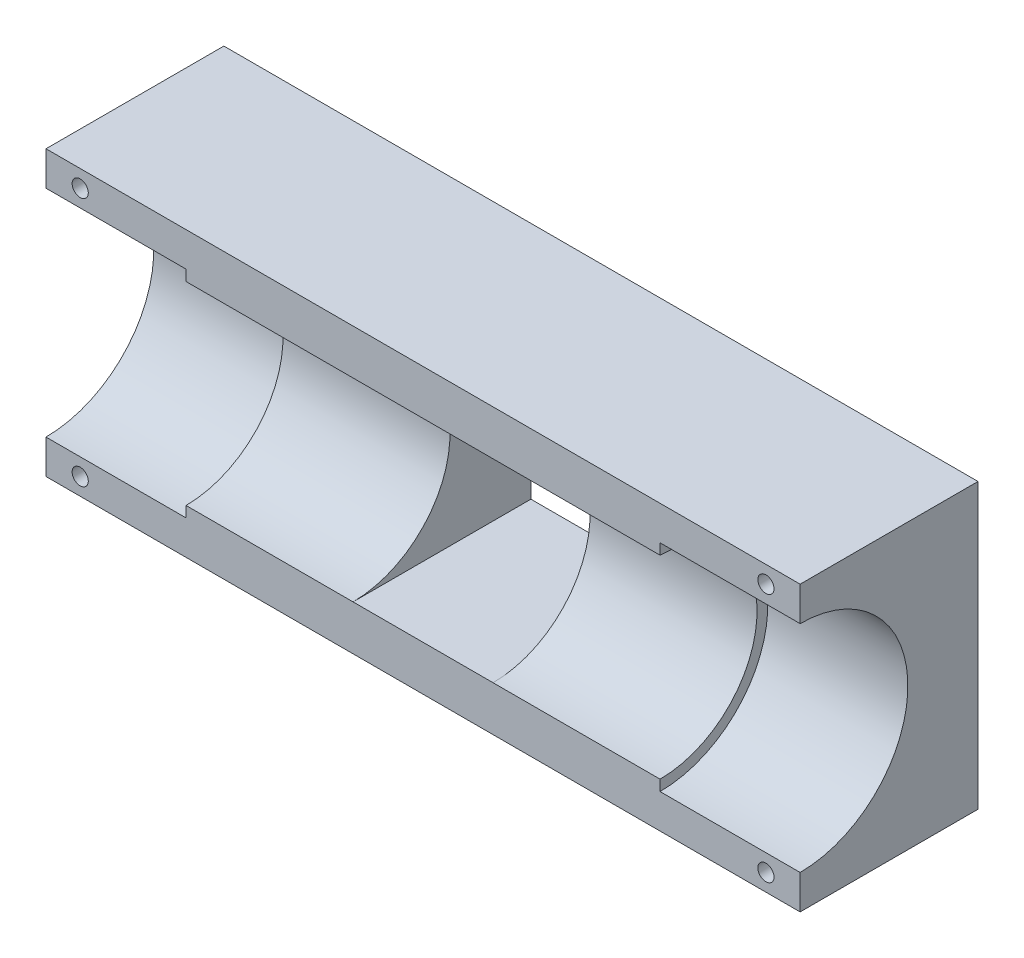
ISO-10303-21;
HEADER;
FILE_DESCRIPTION(('STEP AP214'),'2;1');
FILE_NAME('part.step','',(''),(''),'','','');
FILE_SCHEMA(('AUTOMOTIVE_DESIGN { 1 0 10303 214 1 1 1 1 }'));
ENDSEC;
DATA;
#1=APPLICATION_CONTEXT('core data for automotive mechanical design processes');
#2=APPLICATION_PROTOCOL_DEFINITION('international standard','automotive_design',2000,#1);
#3=PRODUCT_CONTEXT('',#1,'mechanical');
#4=PRODUCT('Part','Part','',(#3));
#5=PRODUCT_RELATED_PRODUCT_CATEGORY('part','',(#4));
#6=PRODUCT_DEFINITION_FORMATION('','',#4);
#7=PRODUCT_DEFINITION_CONTEXT('part definition',#1,'design');
#8=PRODUCT_DEFINITION('design','',#6,#7);
#9=PRODUCT_DEFINITION_SHAPE('','',#8);
#10=(LENGTH_UNIT() NAMED_UNIT(*) SI_UNIT(.MILLI.,.METRE.));
#11=(NAMED_UNIT(*) PLANE_ANGLE_UNIT() SI_UNIT($,.RADIAN.));
#12=(NAMED_UNIT(*) SI_UNIT($,.STERADIAN.) SOLID_ANGLE_UNIT());
#13=UNCERTAINTY_MEASURE_WITH_UNIT(LENGTH_MEASURE(1.E-05),#10,'distance_accuracy_value','');
#14=(GEOMETRIC_REPRESENTATION_CONTEXT(3) GLOBAL_UNCERTAINTY_ASSIGNED_CONTEXT((#13)) GLOBAL_UNIT_ASSIGNED_CONTEXT((#10,
#11,#12)) REPRESENTATION_CONTEXT('',''));
#15=CARTESIAN_POINT('',(0.,0.,0.));
#16=DIRECTION('',(0.,0.,1.));
#17=DIRECTION('',(1.,0.,0.));
#18=AXIS2_PLACEMENT_3D('',#15,#16,#17);
#19=CARTESIAN_POINT('',(139.999999908,26.3499981,33.02));
#20=DIRECTION('',(-1.,0.,0.));
#21=DIRECTION('',(0.,0.,1.));
#22=AXIS2_PLACEMENT_3D('',#19,#20,#21);
#23=CYLINDRICAL_SURFACE('',#22,18.);
#24=DIRECTION('',(-1.,0.,0.));
#25=VECTOR('',#24,1.);
#26=CARTESIAN_POINT('',(139.999999908,8.3499981,33.02));
#27=LINE('',#26,#25);
#28=CARTESIAN_POINT('',(56.999999954,8.34999809999999,33.02));
#29=VERTEX_POINT('',#28);
#30=CARTESIAN_POINT('',(26.,8.3499981,33.02));
#31=VERTEX_POINT('',#30);
#32=EDGE_CURVE('E161',#29,#31,#27,.T.);
#33=ORIENTED_EDGE('',*,*,#32,.F.);
#34=CARTESIAN_POINT('',(56.999999954,26.3499981,33.02));
#35=DIRECTION('',(-1.,0.,0.));
#36=DIRECTION('',(0.,0.,1.));
#37=AXIS2_PLACEMENT_3D('',#34,#35,#36);
#38=CIRCLE('',#37,18.);
#39=CARTESIAN_POINT('',(56.999999954,44.3499981,33.02));
#40=VERTEX_POINT('',#39);
#41=EDGE_CURVE('E139',#29,#40,#38,.F.);
#42=ORIENTED_EDGE('',*,*,#41,.T.);
#43=DIRECTION('',(-1.,0.,0.));
#44=VECTOR('',#43,1.);
#45=CARTESIAN_POINT('',(139.999999908,44.3499981,33.02));
#46=LINE('',#45,#44);
#47=CARTESIAN_POINT('',(26.,44.3499981,33.02));
#48=VERTEX_POINT('',#47);
#49=EDGE_CURVE('E159',#40,#48,#46,.T.);
#50=ORIENTED_EDGE('',*,*,#49,.T.);
#51=CARTESIAN_POINT('',(26.,26.3499981,33.02));
#52=DIRECTION('',(-1.,0.,0.));
#53=DIRECTION('',(0.,0.,1.));
#54=AXIS2_PLACEMENT_3D('',#51,#52,#53);
#55=CIRCLE('',#54,18.);
#56=EDGE_CURVE('E227',#31,#48,#55,.F.);
#57=ORIENTED_EDGE('',*,*,#56,.F.);
#58=EDGE_LOOP('',(#33,#42,#50,#57));
#59=FACE_BOUND('',#58,.T.);
#60=ADVANCED_FACE('F38',(#59),#23,.F.);
#61=CARTESIAN_POINT('',(113.999999908,44.3499981,33.02));
#62=VERTEX_POINT('',#61);
#63=CARTESIAN_POINT('',(82.999999954,44.3499981,33.02));
#64=VERTEX_POINT('',#63);
#65=EDGE_CURVE('E173',#62,#64,#46,.T.);
#66=ORIENTED_EDGE('',*,*,#65,.T.);
#67=CARTESIAN_POINT('',(82.999999954,26.3499981,33.02));
#68=DIRECTION('',(1.,0.,0.));
#69=DIRECTION('',(0.,0.,-1.));
#70=AXIS2_PLACEMENT_3D('',#67,#68,#69);
#71=CIRCLE('',#70,18.);
#72=CARTESIAN_POINT('',(82.999999954,8.34999809999999,33.02));
#73=VERTEX_POINT('',#72);
#74=EDGE_CURVE('E165',#64,#73,#71,.F.);
#75=ORIENTED_EDGE('',*,*,#74,.T.);
#76=CARTESIAN_POINT('',(113.999999908,8.34999810000001,33.02));
#77=VERTEX_POINT('',#76);
#78=EDGE_CURVE('E174',#77,#73,#27,.T.);
#79=ORIENTED_EDGE('',*,*,#78,.F.);
#80=CARTESIAN_POINT('',(113.999999908,26.3499981,33.02));
#81=DIRECTION('',(-1.,0.,0.));
#82=DIRECTION('',(0.,0.,1.));
#83=AXIS2_PLACEMENT_3D('',#80,#81,#82);
#84=CIRCLE('',#83,18.);
#85=EDGE_CURVE('E272',#77,#62,#84,.F.);
#86=ORIENTED_EDGE('',*,*,#85,.T.);
#87=EDGE_LOOP('',(#66,#75,#79,#86));
#88=FACE_BOUND('',#87,.T.);
#89=ADVANCED_FACE('F345',(#88),#23,.F.);
#90=CARTESIAN_POINT('',(0.,0.,33.02));
#91=DIRECTION('',(0.,0.,-1.));
#92=DIRECTION('',(-1.,0.,0.));
#93=AXIS2_PLACEMENT_3D('',#90,#91,#92);
#94=PLANE('',#93);
#95=CARTESIAN_POINT('',(6.35,3.17499905,33.02));
#96=DIRECTION('',(0.,0.,-1.));
#97=DIRECTION('',(-1.,0.,0.));
#98=AXIS2_PLACEMENT_3D('',#95,#96,#97);
#99=CIRCLE('',#98,1.5);
#100=CARTESIAN_POINT('',(4.85,3.17499905,33.02));
#101=VERTEX_POINT('',#100);
#102=EDGE_CURVE('E154',#101,#101,#99,.T.);
#103=ORIENTED_EDGE('',*,*,#102,.T.);
#104=EDGE_LOOP('',(#103));
#105=FACE_BOUND('',#104,.T.);
#106=CARTESIAN_POINT('',(133.649999908,3.17499905,33.02));
#107=DIRECTION('',(0.,0.,-1.));
#108=DIRECTION('',(-1.,0.,0.));
#109=AXIS2_PLACEMENT_3D('',#106,#107,#108);
#110=CIRCLE('',#109,1.5);
#111=CARTESIAN_POINT('',(132.149999908,3.17499905,33.02));
#112=VERTEX_POINT('',#111);
#113=EDGE_CURVE('E520',#112,#112,#110,.T.);
#114=ORIENTED_EDGE('',*,*,#113,.T.);
#115=EDGE_LOOP('',(#114));
#116=FACE_BOUND('',#115,.T.);
#117=DIRECTION('',(0.,1.,0.));
#118=VECTOR('',#117,1.);
#119=CARTESIAN_POINT('',(139.999999908,0.,33.02));
#120=LINE('',#119,#118);
#121=CARTESIAN_POINT('',(139.999999908,0.,33.02));
#122=VERTEX_POINT('',#121);
#123=CARTESIAN_POINT('',(139.999999908,6.3499981,33.02));
#124=VERTEX_POINT('',#123);
#125=EDGE_CURVE('E192',#122,#124,#120,.T.);
#126=ORIENTED_EDGE('',*,*,#125,.T.);
#127=DIRECTION('',(1.,0.,0.));
#128=VECTOR('',#127,1.);
#129=CARTESIAN_POINT('',(113.999999908,6.3499981,33.02));
#130=LINE('',#129,#128);
#131=CARTESIAN_POINT('',(113.999999908,6.3499981,33.02));
#132=VERTEX_POINT('',#131);
#133=EDGE_CURVE('E269',#132,#124,#130,.T.);
#134=ORIENTED_EDGE('',*,*,#133,.F.);
#135=DIRECTION('',(0.,-1.,0.));
#136=VECTOR('',#135,1.);
#137=CARTESIAN_POINT('',(113.999999908,46.3499981,33.02));
#138=LINE('',#137,#136);
#139=EDGE_CURVE('E262',#77,#132,#138,.T.);
#140=ORIENTED_EDGE('',*,*,#139,.F.);
#141=ORIENTED_EDGE('',*,*,#78,.T.);
#142=DIRECTION('',(-1.,0.,0.));
#143=VECTOR('',#142,1.);
#144=CARTESIAN_POINT('',(82.999999954,8.34999809999999,33.02));
#145=LINE('',#144,#143);
#146=EDGE_CURVE('E144',#73,#29,#145,.T.);
#147=ORIENTED_EDGE('',*,*,#146,.T.);
#148=ORIENTED_EDGE('',*,*,#32,.T.);
#149=DIRECTION('',(0.,1.,0.));
#150=VECTOR('',#149,1.);
#151=CARTESIAN_POINT('',(26.,46.3499981,33.02));
#152=LINE('',#151,#150);
#153=CARTESIAN_POINT('',(26.,6.3499981,33.02));
#154=VERTEX_POINT('',#153);
#155=EDGE_CURVE('E284',#154,#31,#152,.T.);
#156=ORIENTED_EDGE('',*,*,#155,.F.);
#157=DIRECTION('',(-1.,0.,0.));
#158=VECTOR('',#157,1.);
#159=CARTESIAN_POINT('',(26.,6.3499981,33.02));
#160=LINE('',#159,#158);
#161=CARTESIAN_POINT('',(0.,6.3499981,33.02));
#162=VERTEX_POINT('',#161);
#163=EDGE_CURVE('E288',#154,#162,#160,.T.);
#164=ORIENTED_EDGE('',*,*,#163,.T.);
#165=DIRECTION('',(0.,-1.,0.));
#166=VECTOR('',#165,1.);
#167=CARTESIAN_POINT('',(0.,0.,33.02));
#168=LINE('',#167,#166);
#169=CARTESIAN_POINT('',(0.,0.,33.02));
#170=VERTEX_POINT('',#169);
#171=EDGE_CURVE('E188',#162,#170,#168,.T.);
#172=ORIENTED_EDGE('',*,*,#171,.T.);
#173=DIRECTION('',(1.,0.,0.));
#174=VECTOR('',#173,1.);
#175=CARTESIAN_POINT('',(0.,0.,33.02));
#176=LINE('',#175,#174);
#177=EDGE_CURVE('E187',#170,#122,#176,.T.);
#178=ORIENTED_EDGE('',*,*,#177,.T.);
#179=EDGE_LOOP('',(#126,#134,#140,#141,#147,#148,#156,#164,#172,#178));
#180=FACE_BOUND('',#179,.T.);
#181=ADVANCED_FACE('F298',(#105,#116,#180),#94,.F.);
#182=CARTESIAN_POINT('',(0.,0.,33.02));
#183=DIRECTION('',(1.,0.,0.));
#184=DIRECTION('',(0.,0.,-1.));
#185=AXIS2_PLACEMENT_3D('',#182,#183,#184);
#186=PLANE('',#185);
#187=ORIENTED_EDGE('',*,*,#171,.F.);
#188=CARTESIAN_POINT('',(0.,26.3499981,33.02));
#189=DIRECTION('',(-1.,0.,0.));
#190=DIRECTION('',(0.,0.,1.));
#191=AXIS2_PLACEMENT_3D('',#188,#189,#190);
#192=CIRCLE('',#191,20.);
#193=CARTESIAN_POINT('',(0.,46.3499981,33.02));
#194=VERTEX_POINT('',#193);
#195=EDGE_CURVE('E279',#194,#162,#192,.T.);
#196=ORIENTED_EDGE('',*,*,#195,.F.);
#197=CARTESIAN_POINT('',(0.,52.6999962,33.02));
#198=VERTEX_POINT('',#197);
#199=EDGE_CURVE('E183',#198,#194,#168,.T.);
#200=ORIENTED_EDGE('',*,*,#199,.F.);
#201=DIRECTION('',(0.,0.,-1.));
#202=VECTOR('',#201,1.);
#203=CARTESIAN_POINT('',(0.,52.6999962,33.02));
#204=LINE('',#203,#202);
#205=CARTESIAN_POINT('',(0.,52.6999962,0.));
#206=VERTEX_POINT('',#205);
#207=EDGE_CURVE('E199',#198,#206,#204,.T.);
#208=ORIENTED_EDGE('',*,*,#207,.T.);
#209=DIRECTION('',(0.,-1.,0.));
#210=VECTOR('',#209,1.);
#211=CARTESIAN_POINT('',(0.,0.,0.));
#212=LINE('',#211,#210);
#213=CARTESIAN_POINT('',(0.,0.,0.));
#214=VERTEX_POINT('',#213);
#215=EDGE_CURVE('E178',#206,#214,#212,.T.);
#216=ORIENTED_EDGE('',*,*,#215,.T.);
#217=DIRECTION('',(0.,0.,-1.));
#218=VECTOR('',#217,1.);
#219=CARTESIAN_POINT('',(0.,0.,33.02));
#220=LINE('',#219,#218);
#221=EDGE_CURVE('E223',#170,#214,#220,.T.);
#222=ORIENTED_EDGE('',*,*,#221,.F.);
#223=EDGE_LOOP('',(#187,#196,#200,#208,#216,#222));
#224=FACE_BOUND('',#223,.T.);
#225=ADVANCED_FACE('F40',(#224),#186,.F.);
#226=CARTESIAN_POINT('',(0.,0.,33.02));
#227=DIRECTION('',(0.,1.,0.));
#228=DIRECTION('',(0.,0.,1.));
#229=AXIS2_PLACEMENT_3D('',#226,#227,#228);
#230=PLANE('',#229);
#231=DIRECTION('',(1.,0.,0.));
#232=VECTOR('',#231,1.);
#233=CARTESIAN_POINT('',(0.,0.,0.));
#234=LINE('',#233,#232);
#235=CARTESIAN_POINT('',(139.999999908,0.,0.));
#236=VERTEX_POINT('',#235);
#237=EDGE_CURVE('E203',#214,#236,#234,.T.);
#238=ORIENTED_EDGE('',*,*,#237,.T.);
#239=DIRECTION('',(0.,0.,-1.));
#240=VECTOR('',#239,1.);
#241=CARTESIAN_POINT('',(139.999999908,0.,33.02));
#242=LINE('',#241,#240);
#243=EDGE_CURVE('E219',#122,#236,#242,.T.);
#244=ORIENTED_EDGE('',*,*,#243,.F.);
#245=ORIENTED_EDGE('',*,*,#177,.F.);
#246=ORIENTED_EDGE('',*,*,#221,.T.);
#247=EDGE_LOOP('',(#238,#244,#245,#246));
#248=FACE_BOUND('',#247,.T.);
#249=ADVANCED_FACE('F337',(#248),#230,.F.);
#250=CARTESIAN_POINT('',(139.999999908,0.,33.02));
#251=DIRECTION('',(-1.,0.,0.));
#252=DIRECTION('',(0.,0.,1.));
#253=AXIS2_PLACEMENT_3D('',#250,#251,#252);
#254=PLANE('',#253);
#255=CARTESIAN_POINT('',(139.999999908,46.3499981,33.02));
#256=VERTEX_POINT('',#255);
#257=CARTESIAN_POINT('',(139.999999908,52.6999962,33.02));
#258=VERTEX_POINT('',#257);
#259=EDGE_CURVE('E191',#256,#258,#120,.T.);
#260=ORIENTED_EDGE('',*,*,#259,.F.);
#261=CARTESIAN_POINT('',(139.999999908,26.3499981,33.02));
#262=DIRECTION('',(1.,0.,0.));
#263=DIRECTION('',(0.,0.,1.));
#264=AXIS2_PLACEMENT_3D('',#261,#262,#263);
#265=CIRCLE('',#264,20.);
#266=EDGE_CURVE('E164',#124,#256,#265,.T.);
#267=ORIENTED_EDGE('',*,*,#266,.F.);
#268=ORIENTED_EDGE('',*,*,#125,.F.);
#269=ORIENTED_EDGE('',*,*,#243,.T.);
#270=DIRECTION('',(0.,1.,0.));
#271=VECTOR('',#270,1.);
#272=CARTESIAN_POINT('',(139.999999908,0.,0.));
#273=LINE('',#272,#271);
#274=CARTESIAN_POINT('',(139.999999908,52.6999962,0.));
#275=VERTEX_POINT('',#274);
#276=EDGE_CURVE('E206',#236,#275,#273,.T.);
#277=ORIENTED_EDGE('',*,*,#276,.T.);
#278=DIRECTION('',(0.,0.,-1.));
#279=VECTOR('',#278,1.);
#280=CARTESIAN_POINT('',(139.999999908,52.6999962,33.02));
#281=LINE('',#280,#279);
#282=EDGE_CURVE('E215',#258,#275,#281,.T.);
#283=ORIENTED_EDGE('',*,*,#282,.F.);
#284=EDGE_LOOP('',(#260,#267,#268,#269,#277,#283));
#285=FACE_BOUND('',#284,.T.);
#286=ADVANCED_FACE('F315',(#285),#254,.F.);
#287=CARTESIAN_POINT('',(0.,52.6999962,33.02));
#288=DIRECTION('',(0.,-1.,0.));
#289=DIRECTION('',(0.,0.,-1.));
#290=AXIS2_PLACEMENT_3D('',#287,#288,#289);
#291=PLANE('',#290);
#292=DIRECTION('',(-1.,0.,0.));
#293=VECTOR('',#292,1.);
#294=CARTESIAN_POINT('',(0.,52.6999962,0.));
#295=LINE('',#294,#293);
#296=EDGE_CURVE('E209',#275,#206,#295,.T.);
#297=ORIENTED_EDGE('',*,*,#296,.T.);
#298=ORIENTED_EDGE('',*,*,#207,.F.);
#299=DIRECTION('',(-1.,0.,0.));
#300=VECTOR('',#299,1.);
#301=CARTESIAN_POINT('',(0.,52.6999962,33.02));
#302=LINE('',#301,#300);
#303=EDGE_CURVE('E196',#258,#198,#302,.T.);
#304=ORIENTED_EDGE('',*,*,#303,.F.);
#305=ORIENTED_EDGE('',*,*,#282,.T.);
#306=EDGE_LOOP('',(#297,#298,#304,#305));
#307=FACE_BOUND('',#306,.T.);
#308=ADVANCED_FACE('F319',(#307),#291,.F.);
#309=CARTESIAN_POINT('',(133.649999908,49.52499715,33.02));
#310=DIRECTION('',(0.,0.,-1.));
#311=DIRECTION('',(-1.,0.,0.));
#312=AXIS2_PLACEMENT_3D('',#309,#310,#311);
#313=CIRCLE('',#312,1.5);
#314=CARTESIAN_POINT('',(132.149999908,49.52499715,33.02));
#315=VERTEX_POINT('',#314);
#316=EDGE_CURVE('E523',#315,#315,#313,.T.);
#317=ORIENTED_EDGE('',*,*,#316,.T.);
#318=EDGE_LOOP('',(#317));
#319=FACE_BOUND('',#318,.T.);
#320=CARTESIAN_POINT('',(6.35,49.52499715,33.02));
#321=DIRECTION('',(0.,0.,-1.));
#322=DIRECTION('',(-1.,0.,0.));
#323=AXIS2_PLACEMENT_3D('',#320,#321,#322);
#324=CIRCLE('',#323,1.500000048);
#325=CARTESIAN_POINT('',(4.849999952,49.52499715,33.02));
#326=VERTEX_POINT('',#325);
#327=EDGE_CURVE('E524',#326,#326,#324,.T.);
#328=ORIENTED_EDGE('',*,*,#327,.T.);
#329=EDGE_LOOP('',(#328));
#330=FACE_BOUND('',#329,.T.);
#331=CARTESIAN_POINT('',(113.999999908,46.3499981,33.02));
#332=VERTEX_POINT('',#331);
#333=EDGE_CURVE('E263',#332,#62,#138,.T.);
#334=ORIENTED_EDGE('',*,*,#333,.F.);
#335=DIRECTION('',(1.,0.,0.));
#336=VECTOR('',#335,1.);
#337=CARTESIAN_POINT('',(113.999999908,46.3499981,33.02));
#338=LINE('',#337,#336);
#339=EDGE_CURVE('E266',#332,#256,#338,.T.);
#340=ORIENTED_EDGE('',*,*,#339,.T.);
#341=ORIENTED_EDGE('',*,*,#259,.T.);
#342=ORIENTED_EDGE('',*,*,#303,.T.);
#343=ORIENTED_EDGE('',*,*,#199,.T.);
#344=DIRECTION('',(-1.,0.,0.));
#345=VECTOR('',#344,1.);
#346=CARTESIAN_POINT('',(26.,46.3499981,33.02));
#347=LINE('',#346,#345);
#348=CARTESIAN_POINT('',(26.,46.3499981,33.02));
#349=VERTEX_POINT('',#348);
#350=EDGE_CURVE('E291',#349,#194,#347,.T.);
#351=ORIENTED_EDGE('',*,*,#350,.F.);
#352=EDGE_CURVE('E171',#48,#349,#152,.T.);
#353=ORIENTED_EDGE('',*,*,#352,.F.);
#354=ORIENTED_EDGE('',*,*,#49,.F.);
#355=DIRECTION('',(1.,0.,0.));
#356=VECTOR('',#355,1.);
#357=CARTESIAN_POINT('',(82.999999954,44.3499981,33.02));
#358=LINE('',#357,#356);
#359=EDGE_CURVE('E147',#40,#64,#358,.T.);
#360=ORIENTED_EDGE('',*,*,#359,.T.);
#361=ORIENTED_EDGE('',*,*,#65,.F.);
#362=EDGE_LOOP('',(#334,#340,#341,#342,#343,#351,#353,#354,#360,#361));
#363=FACE_BOUND('',#362,.T.);
#364=ADVANCED_FACE('F169',(#319,#330,#363),#94,.F.);
#365=CARTESIAN_POINT('',(0.,0.,0.));
#366=DIRECTION('',(0.,0.,-1.));
#367=DIRECTION('',(-1.,0.,0.));
#368=AXIS2_PLACEMENT_3D('',#365,#366,#367);
#369=PLANE('',#368);
#370=CARTESIAN_POINT('',(6.35,3.17499905,0.));
#371=DIRECTION('',(0.,0.,1.));
#372=DIRECTION('',(1.,0.,0.));
#373=AXIS2_PLACEMENT_3D('',#370,#371,#372);
#374=CIRCLE('',#373,1.5);
#375=CARTESIAN_POINT('',(7.85,3.17499905,0.));
#376=VERTEX_POINT('',#375);
#377=EDGE_CURVE('E542',#376,#376,#374,.T.);
#378=ORIENTED_EDGE('',*,*,#377,.T.);
#379=EDGE_LOOP('',(#378));
#380=FACE_BOUND('',#379,.T.);
#381=CARTESIAN_POINT('',(133.649999908,49.52499715,0.));
#382=DIRECTION('',(0.,0.,1.));
#383=DIRECTION('',(1.,0.,0.));
#384=AXIS2_PLACEMENT_3D('',#381,#382,#383);
#385=CIRCLE('',#384,1.5);
#386=CARTESIAN_POINT('',(135.149999908,49.52499715,0.));
#387=VERTEX_POINT('',#386);
#388=EDGE_CURVE('E543',#387,#387,#385,.T.);
#389=ORIENTED_EDGE('',*,*,#388,.T.);
#390=EDGE_LOOP('',(#389));
#391=FACE_BOUND('',#390,.T.);
#392=CARTESIAN_POINT('',(133.649999908,3.17499905,0.));
#393=DIRECTION('',(0.,0.,1.));
#394=DIRECTION('',(1.,0.,0.));
#395=AXIS2_PLACEMENT_3D('',#392,#393,#394);
#396=CIRCLE('',#395,1.5);
#397=CARTESIAN_POINT('',(135.149999908,3.17499905,0.));
#398=VERTEX_POINT('',#397);
#399=EDGE_CURVE('E547',#398,#398,#396,.T.);
#400=ORIENTED_EDGE('',*,*,#399,.T.);
#401=EDGE_LOOP('',(#400));
#402=FACE_BOUND('',#401,.T.);
#403=CARTESIAN_POINT('',(6.35,49.52499715,0.));
#404=DIRECTION('',(0.,0.,1.));
#405=DIRECTION('',(1.,0.,0.));
#406=AXIS2_PLACEMENT_3D('',#403,#404,#405);
#407=CIRCLE('',#406,1.500000048);
#408=CARTESIAN_POINT('',(7.850000048,49.52499715,0.));
#409=VERTEX_POINT('',#408);
#410=EDGE_CURVE('E531',#409,#409,#407,.T.);
#411=ORIENTED_EDGE('',*,*,#410,.T.);
#412=EDGE_LOOP('',(#411));
#413=FACE_BOUND('',#412,.T.);
#414=DIRECTION('',(0.,1.,0.));
#415=VECTOR('',#414,1.);
#416=CARTESIAN_POINT('',(56.999999954,0.,0.));
#417=LINE('',#416,#415);
#418=CARTESIAN_POINT('',(56.999999954,8.34999809999999,0.));
#419=VERTEX_POINT('',#418);
#420=CARTESIAN_POINT('',(56.999999954,44.3499981,0.));
#421=VERTEX_POINT('',#420);
#422=EDGE_CURVE('E11',#419,#421,#417,.T.);
#423=ORIENTED_EDGE('',*,*,#422,.F.);
#424=DIRECTION('',(-1.,0.,0.));
#425=VECTOR('',#424,1.);
#426=CARTESIAN_POINT('',(0.,8.34999809999999,0.));
#427=LINE('',#426,#425);
#428=CARTESIAN_POINT('',(82.999999954,8.34999809999999,0.));
#429=VERTEX_POINT('',#428);
#430=EDGE_CURVE('E47',#429,#419,#427,.T.);
#431=ORIENTED_EDGE('',*,*,#430,.F.);
#432=DIRECTION('',(0.,-1.,0.));
#433=VECTOR('',#432,1.);
#434=CARTESIAN_POINT('',(82.999999954,0.,0.));
#435=LINE('',#434,#433);
#436=CARTESIAN_POINT('',(82.999999954,44.3499981,0.));
#437=VERTEX_POINT('',#436);
#438=EDGE_CURVE('E233',#437,#429,#435,.T.);
#439=ORIENTED_EDGE('',*,*,#438,.F.);
#440=DIRECTION('',(1.,0.,0.));
#441=VECTOR('',#440,1.);
#442=CARTESIAN_POINT('',(0.,44.3499981,0.));
#443=LINE('',#442,#441);
#444=EDGE_CURVE('E230',#421,#437,#443,.T.);
#445=ORIENTED_EDGE('',*,*,#444,.F.);
#446=EDGE_LOOP('',(#423,#431,#439,#445));
#447=FACE_BOUND('',#446,.T.);
#448=ORIENTED_EDGE('',*,*,#215,.F.);
#449=ORIENTED_EDGE('',*,*,#296,.F.);
#450=ORIENTED_EDGE('',*,*,#276,.F.);
#451=ORIENTED_EDGE('',*,*,#237,.F.);
#452=EDGE_LOOP('',(#448,#449,#450,#451));
#453=FACE_BOUND('',#452,.T.);
#454=ADVANCED_FACE('F247',(#380,#391,#402,#413,#447,#453),#369,.T.);
#455=CARTESIAN_POINT('',(26.,26.3499981,33.02));
#456=DIRECTION('',(-1.,0.,0.));
#457=DIRECTION('',(0.,0.,1.));
#458=AXIS2_PLACEMENT_3D('',#455,#456,#457);
#459=PLANE('',#458);
#460=ORIENTED_EDGE('',*,*,#56,.T.);
#461=ORIENTED_EDGE('',*,*,#352,.T.);
#462=CARTESIAN_POINT('',(26.,26.3499981,33.02));
#463=DIRECTION('',(-1.,0.,0.));
#464=DIRECTION('',(0.,0.,1.));
#465=AXIS2_PLACEMENT_3D('',#462,#463,#464);
#466=CIRCLE('',#465,20.);
#467=EDGE_CURVE('E280',#349,#154,#466,.T.);
#468=ORIENTED_EDGE('',*,*,#467,.T.);
#469=ORIENTED_EDGE('',*,*,#155,.T.);
#470=EDGE_LOOP('',(#460,#461,#468,#469));
#471=FACE_BOUND('',#470,.T.);
#472=ADVANCED_FACE('F323',(#471),#459,.T.);
#473=CARTESIAN_POINT('',(26.,26.3499981,33.02));
#474=DIRECTION('',(-1.,0.,0.));
#475=DIRECTION('',(0.,0.,1.));
#476=AXIS2_PLACEMENT_3D('',#473,#474,#475);
#477=CYLINDRICAL_SURFACE('',#476,20.);
#478=ORIENTED_EDGE('',*,*,#195,.T.);
#479=ORIENTED_EDGE('',*,*,#163,.F.);
#480=ORIENTED_EDGE('',*,*,#467,.F.);
#481=ORIENTED_EDGE('',*,*,#350,.T.);
#482=EDGE_LOOP('',(#478,#479,#480,#481));
#483=FACE_BOUND('',#482,.T.);
#484=ADVANCED_FACE('F321',(#483),#477,.F.);
#485=CARTESIAN_POINT('',(113.999999908,26.3499981,33.02));
#486=DIRECTION('',(-1.,0.,0.));
#487=DIRECTION('',(0.,0.,1.));
#488=AXIS2_PLACEMENT_3D('',#485,#486,#487);
#489=PLANE('',#488);
#490=ORIENTED_EDGE('',*,*,#139,.T.);
#491=CARTESIAN_POINT('',(113.999999908,26.3499981,33.02));
#492=DIRECTION('',(1.,0.,0.));
#493=DIRECTION('',(0.,0.,1.));
#494=AXIS2_PLACEMENT_3D('',#491,#492,#493);
#495=CIRCLE('',#494,20.);
#496=EDGE_CURVE('E259',#132,#332,#495,.T.);
#497=ORIENTED_EDGE('',*,*,#496,.T.);
#498=ORIENTED_EDGE('',*,*,#333,.T.);
#499=ORIENTED_EDGE('',*,*,#85,.F.);
#500=EDGE_LOOP('',(#490,#497,#498,#499));
#501=FACE_BOUND('',#500,.T.);
#502=ADVANCED_FACE('F329',(#501),#489,.F.);
#503=CARTESIAN_POINT('',(113.999999908,26.3499981,33.02));
#504=DIRECTION('',(1.,0.,0.));
#505=DIRECTION('',(0.,0.,-1.));
#506=AXIS2_PLACEMENT_3D('',#503,#504,#505);
#507=CYLINDRICAL_SURFACE('',#506,20.);
#508=ORIENTED_EDGE('',*,*,#266,.T.);
#509=ORIENTED_EDGE('',*,*,#339,.F.);
#510=ORIENTED_EDGE('',*,*,#496,.F.);
#511=ORIENTED_EDGE('',*,*,#133,.T.);
#512=EDGE_LOOP('',(#508,#509,#510,#511));
#513=FACE_BOUND('',#512,.T.);
#514=ADVANCED_FACE('F333',(#513),#507,.F.);
#515=CARTESIAN_POINT('',(56.999999954,44.3499981,33.02));
#516=DIRECTION('',(-1.,0.,0.));
#517=DIRECTION('',(0.,0.,1.));
#518=AXIS2_PLACEMENT_3D('',#515,#516,#517);
#519=PLANE('',#518);
#520=DIRECTION('',(0.,0.,-1.));
#521=VECTOR('',#520,1.);
#522=CARTESIAN_POINT('',(56.999999954,8.34999809999999,33.02));
#523=LINE('',#522,#521);
#524=EDGE_CURVE('E241',#29,#419,#523,.T.);
#525=ORIENTED_EDGE('',*,*,#524,.T.);
#526=ORIENTED_EDGE('',*,*,#422,.T.);
#527=DIRECTION('',(0.,0.,-1.));
#528=VECTOR('',#527,1.);
#529=CARTESIAN_POINT('',(56.999999954,44.3499981,33.02));
#530=LINE('',#529,#528);
#531=EDGE_CURVE('E59',#40,#421,#530,.T.);
#532=ORIENTED_EDGE('',*,*,#531,.F.);
#533=ORIENTED_EDGE('',*,*,#41,.F.);
#534=EDGE_LOOP('',(#525,#526,#532,#533));
#535=FACE_BOUND('',#534,.T.);
#536=ADVANCED_FACE('F137',(#535),#519,.F.);
#537=CARTESIAN_POINT('',(82.999999954,44.3499981,33.02));
#538=DIRECTION('',(1.,0.,0.));
#539=DIRECTION('',(0.,0.,-1.));
#540=AXIS2_PLACEMENT_3D('',#537,#538,#539);
#541=PLANE('',#540);
#542=DIRECTION('',(0.,0.,-1.));
#543=VECTOR('',#542,1.);
#544=CARTESIAN_POINT('',(82.999999954,44.3499981,33.02));
#545=LINE('',#544,#543);
#546=EDGE_CURVE('E54',#64,#437,#545,.T.);
#547=ORIENTED_EDGE('',*,*,#546,.T.);
#548=ORIENTED_EDGE('',*,*,#438,.T.);
#549=DIRECTION('',(0.,0.,-1.));
#550=VECTOR('',#549,1.);
#551=CARTESIAN_POINT('',(82.999999954,8.34999809999999,33.02));
#552=LINE('',#551,#550);
#553=EDGE_CURVE('E242',#73,#429,#552,.T.);
#554=ORIENTED_EDGE('',*,*,#553,.F.);
#555=ORIENTED_EDGE('',*,*,#74,.F.);
#556=EDGE_LOOP('',(#547,#548,#554,#555));
#557=FACE_BOUND('',#556,.T.);
#558=ADVANCED_FACE('F250',(#557),#541,.F.);
#559=CARTESIAN_POINT('',(82.999999954,8.34999809999999,33.02));
#560=DIRECTION('',(0.,-1.,0.));
#561=DIRECTION('',(0.,0.,-1.));
#562=AXIS2_PLACEMENT_3D('',#559,#560,#561);
#563=PLANE('',#562);
#564=ORIENTED_EDGE('',*,*,#430,.T.);
#565=ORIENTED_EDGE('',*,*,#524,.F.);
#566=ORIENTED_EDGE('',*,*,#146,.F.);
#567=ORIENTED_EDGE('',*,*,#553,.T.);
#568=EDGE_LOOP('',(#564,#565,#566,#567));
#569=FACE_BOUND('',#568,.T.);
#570=ADVANCED_FACE('F239',(#569),#563,.F.);
#571=CARTESIAN_POINT('',(82.999999954,44.3499981,33.02));
#572=DIRECTION('',(0.,1.,0.));
#573=DIRECTION('',(0.,0.,1.));
#574=AXIS2_PLACEMENT_3D('',#571,#572,#573);
#575=PLANE('',#574);
#576=ORIENTED_EDGE('',*,*,#444,.T.);
#577=ORIENTED_EDGE('',*,*,#546,.F.);
#578=ORIENTED_EDGE('',*,*,#359,.F.);
#579=ORIENTED_EDGE('',*,*,#531,.T.);
#580=EDGE_LOOP('',(#576,#577,#578,#579));
#581=FACE_BOUND('',#580,.T.);
#582=ADVANCED_FACE('F148',(#581),#575,.F.);
#583=CARTESIAN_POINT('',(6.35,49.52499715,0.));
#584=DIRECTION('',(0.,0.,1.));
#585=DIRECTION('',(1.,0.,0.));
#586=AXIS2_PLACEMENT_3D('',#583,#584,#585);
#587=CYLINDRICAL_SURFACE('',#586,1.500000048);
#588=ORIENTED_EDGE('',*,*,#410,.F.);
#589=EDGE_LOOP('',(#588));
#590=FACE_BOUND('',#589,.T.);
#591=ORIENTED_EDGE('',*,*,#327,.F.);
#592=EDGE_LOOP('',(#591));
#593=FACE_BOUND('',#592,.T.);
#594=ADVANCED_FACE('F423',(#590,#593),#587,.F.);
#595=CARTESIAN_POINT('',(133.649999908,3.17499905,0.));
#596=DIRECTION('',(0.,0.,1.));
#597=DIRECTION('',(1.,0.,0.));
#598=AXIS2_PLACEMENT_3D('',#595,#596,#597);
#599=CYLINDRICAL_SURFACE('',#598,1.5);
#600=ORIENTED_EDGE('',*,*,#399,.F.);
#601=EDGE_LOOP('',(#600));
#602=FACE_BOUND('',#601,.T.);
#603=ORIENTED_EDGE('',*,*,#113,.F.);
#604=EDGE_LOOP('',(#603));
#605=FACE_BOUND('',#604,.T.);
#606=ADVANCED_FACE('F429',(#602,#605),#599,.F.);
#607=CARTESIAN_POINT('',(133.649999908,49.52499715,0.));
#608=DIRECTION('',(0.,0.,1.));
#609=DIRECTION('',(1.,0.,0.));
#610=AXIS2_PLACEMENT_3D('',#607,#608,#609);
#611=CYLINDRICAL_SURFACE('',#610,1.5);
#612=ORIENTED_EDGE('',*,*,#388,.F.);
#613=EDGE_LOOP('',(#612));
#614=FACE_BOUND('',#613,.T.);
#615=ORIENTED_EDGE('',*,*,#316,.F.);
#616=EDGE_LOOP('',(#615));
#617=FACE_BOUND('',#616,.T.);
#618=ADVANCED_FACE('F437',(#614,#617),#611,.F.);
#619=CARTESIAN_POINT('',(6.35,3.17499905,0.));
#620=DIRECTION('',(0.,0.,1.));
#621=DIRECTION('',(1.,0.,0.));
#622=AXIS2_PLACEMENT_3D('',#619,#620,#621);
#623=CYLINDRICAL_SURFACE('',#622,1.5);
#624=ORIENTED_EDGE('',*,*,#377,.F.);
#625=EDGE_LOOP('',(#624));
#626=FACE_BOUND('',#625,.T.);
#627=ORIENTED_EDGE('',*,*,#102,.F.);
#628=EDGE_LOOP('',(#627));
#629=FACE_BOUND('',#628,.T.);
#630=ADVANCED_FACE('F445',(#626,#629),#623,.F.);
#631=CLOSED_SHELL('',(#60,#89,#181,#225,#249,#286,#308,#364,#454,#472,#484,#502,#514,#536,#558,
#570,#582,#594,#606,#618,#630));
#632=MANIFOLD_SOLID_BREP('B2',#631);
#633=ADVANCED_BREP_SHAPE_REPRESENTATION('',(#18,#632),#14);
#634=SHAPE_DEFINITION_REPRESENTATION(#9,#633);
ENDSEC;
END-ISO-10303-21;
